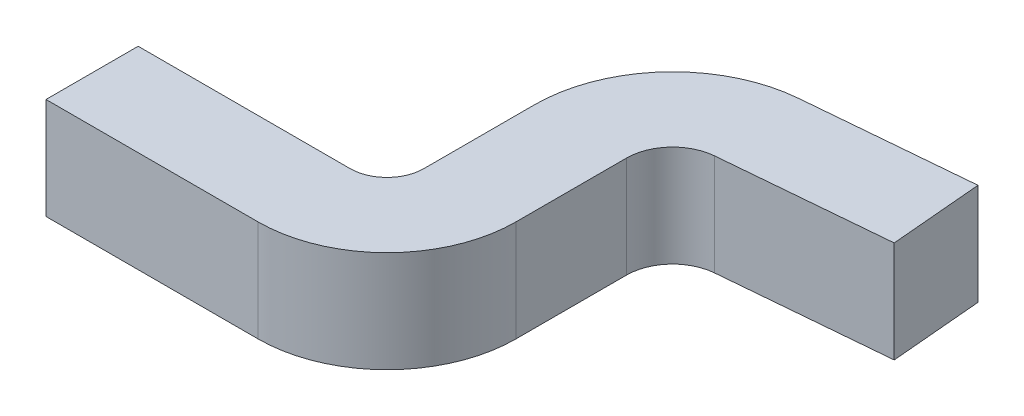
ISO-10303-21;
HEADER;
FILE_DESCRIPTION(('STEP AP214'),'2;1');
FILE_NAME('part.step','',(''),(''),'','','');
FILE_SCHEMA(('AUTOMOTIVE_DESIGN { 1 0 10303 214 1 1 1 1 }'));
ENDSEC;
DATA;
#1=APPLICATION_CONTEXT('core data for automotive mechanical design processes');
#2=APPLICATION_PROTOCOL_DEFINITION('international standard','automotive_design',2000,#1);
#3=PRODUCT_CONTEXT('',#1,'mechanical');
#4=PRODUCT('Part','Part','',(#3));
#5=PRODUCT_RELATED_PRODUCT_CATEGORY('part','',(#4));
#6=PRODUCT_DEFINITION_FORMATION('','',#4);
#7=PRODUCT_DEFINITION_CONTEXT('part definition',#1,'design');
#8=PRODUCT_DEFINITION('design','',#6,#7);
#9=PRODUCT_DEFINITION_SHAPE('','',#8);
#10=(LENGTH_UNIT() NAMED_UNIT(*) SI_UNIT(.MILLI.,.METRE.));
#11=(NAMED_UNIT(*) PLANE_ANGLE_UNIT() SI_UNIT($,.RADIAN.));
#12=(NAMED_UNIT(*) SI_UNIT($,.STERADIAN.) SOLID_ANGLE_UNIT());
#13=UNCERTAINTY_MEASURE_WITH_UNIT(LENGTH_MEASURE(1.E-05),#10,'distance_accuracy_value','');
#14=(GEOMETRIC_REPRESENTATION_CONTEXT(3) GLOBAL_UNCERTAINTY_ASSIGNED_CONTEXT((#13)) GLOBAL_UNIT_ASSIGNED_CONTEXT((#10,
#11,#12)) REPRESENTATION_CONTEXT('',''));
#15=CARTESIAN_POINT('',(0.,0.,0.));
#16=DIRECTION('',(0.,0.,1.));
#17=DIRECTION('',(1.,0.,0.));
#18=AXIS2_PLACEMENT_3D('',#15,#16,#17);
#19=CARTESIAN_POINT('',(5.445,-0.14,0.42500000000001));
#20=DIRECTION('',(0.,1.,0.));
#21=DIRECTION('',(0.,0.,1.));
#22=AXIS2_PLACEMENT_3D('',#19,#20,#21);
#23=PLANE('',#22);
#24=DIRECTION('',(-0.0871557427476632,0.,-0.996194698091745));
#25=VECTOR('',#24,1.);
#26=CARTESIAN_POINT('',(6.04,-0.14,0.199238939618369));
#27=LINE('',#26,#25);
#28=CARTESIAN_POINT('',(6.02256885145047,-0.14,0.));
#29=VERTEX_POINT('',#28);
#30=CARTESIAN_POINT('',(6.04,-0.14,0.199238939618369));
#31=VERTEX_POINT('',#30);
#32=EDGE_CURVE('E160',#29,#31,#27,.F.);
#33=ORIENTED_EDGE('',*,*,#32,.F.);
#34=DIRECTION('',(-0.996194698091745,0.,0.0871557427476612));
#35=VECTOR('',#34,1.);
#36=CARTESIAN_POINT('',(6.02256885145047,-0.14,0.));
#37=LINE('',#36,#35);
#38=CARTESIAN_POINT('',(5.66385327717569,-0.14,0.0313835461792554));
#39=VERTEX_POINT('',#38);
#40=EDGE_CURVE('E122',#39,#29,#37,.F.);
#41=ORIENTED_EDGE('',*,*,#40,.F.);
#42=CARTESIAN_POINT('',(5.68999999999999,-0.14,0.330241955606771));
#43=DIRECTION('',(0.,1.,0.));
#44=DIRECTION('',(0.,0.,1.));
#45=AXIS2_PLACEMENT_3D('',#42,#43,#44);
#46=CIRCLE('',#45,0.299999999999992);
#47=CARTESIAN_POINT('',(5.39,-0.14,0.33024195560677));
#48=VERTEX_POINT('',#47);
#49=EDGE_CURVE('E127',#48,#39,#46,.F.);
#50=ORIENTED_EDGE('',*,*,#49,.F.);
#51=DIRECTION('',(0.,0.,1.));
#52=VECTOR('',#51,1.);
#53=CARTESIAN_POINT('',(5.39,-0.14,0.330241955606771));
#54=LINE('',#53,#52);
#55=CARTESIAN_POINT('',(5.39,-0.14,0.57));
#56=VERTEX_POINT('',#55);
#57=EDGE_CURVE('E196',#56,#48,#54,.F.);
#58=ORIENTED_EDGE('',*,*,#57,.F.);
#59=CARTESIAN_POINT('',(5.31,-0.14,0.57));
#60=DIRECTION('',(0.,1.,0.));
#61=DIRECTION('',(0.,0.,1.));
#62=AXIS2_PLACEMENT_3D('',#59,#60,#61);
#63=CIRCLE('',#62,0.0800000000000001);
#64=CARTESIAN_POINT('',(5.31,-0.14,0.65));
#65=VERTEX_POINT('',#64);
#66=EDGE_CURVE('E238',#56,#65,#63,.F.);
#67=ORIENTED_EDGE('',*,*,#66,.T.);
#68=DIRECTION('',(-1.,0.,0.));
#69=VECTOR('',#68,1.);
#70=CARTESIAN_POINT('',(5.31,-0.14,0.65));
#71=LINE('',#70,#69);
#72=CARTESIAN_POINT('',(4.85,-0.14,0.65));
#73=VERTEX_POINT('',#72);
#74=EDGE_CURVE('E201',#73,#65,#71,.F.);
#75=ORIENTED_EDGE('',*,*,#74,.F.);
#76=DIRECTION('',(0.,0.,1.));
#77=VECTOR('',#76,1.);
#78=CARTESIAN_POINT('',(4.85,-0.14,0.65));
#79=LINE('',#78,#77);
#80=CARTESIAN_POINT('',(4.85,-0.14,0.85));
#81=VERTEX_POINT('',#80);
#82=EDGE_CURVE('E193',#81,#73,#79,.F.);
#83=ORIENTED_EDGE('',*,*,#82,.F.);
#84=DIRECTION('',(1.,0.,0.));
#85=VECTOR('',#84,1.);
#86=CARTESIAN_POINT('',(4.85,-0.14,0.85));
#87=LINE('',#86,#85);
#88=CARTESIAN_POINT('',(5.31,-0.14,0.85));
#89=VERTEX_POINT('',#88);
#90=EDGE_CURVE('E99',#89,#81,#87,.F.);
#91=ORIENTED_EDGE('',*,*,#90,.F.);
#92=CARTESIAN_POINT('',(5.31,-0.14,0.57));
#93=DIRECTION('',(0.,1.,0.));
#94=DIRECTION('',(0.,0.,1.));
#95=AXIS2_PLACEMENT_3D('',#92,#93,#94);
#96=CIRCLE('',#95,0.28);
#97=CARTESIAN_POINT('',(5.59,-0.14,0.570000000000001));
#98=VERTEX_POINT('',#97);
#99=EDGE_CURVE('E20',#98,#89,#96,.F.);
#100=ORIENTED_EDGE('',*,*,#99,.F.);
#101=DIRECTION('',(0.,0.,-1.));
#102=VECTOR('',#101,1.);
#103=CARTESIAN_POINT('',(5.59,-0.14,0.57));
#104=LINE('',#103,#102);
#105=CARTESIAN_POINT('',(5.59,-0.14,0.330241955606771));
#106=VERTEX_POINT('',#105);
#107=EDGE_CURVE('E88',#106,#98,#104,.F.);
#108=ORIENTED_EDGE('',*,*,#107,.F.);
#109=CARTESIAN_POINT('',(5.68999999999999,-0.14,0.330241955606771));
#110=DIRECTION('',(0.,1.,0.));
#111=DIRECTION('',(0.,0.,1.));
#112=AXIS2_PLACEMENT_3D('',#109,#110,#111);
#113=CIRCLE('',#112,0.0999999999999921);
#114=CARTESIAN_POINT('',(5.68128442572522,-0.14,0.230622485797604));
#115=VERTEX_POINT('',#114);
#116=EDGE_CURVE('E170',#106,#115,#113,.F.);
#117=ORIENTED_EDGE('',*,*,#116,.T.);
#118=DIRECTION('',(0.996194698091745,0.,-0.0871557427476609));
#119=VECTOR('',#118,1.);
#120=CARTESIAN_POINT('',(5.68128442572522,-0.14,0.230622485797604));
#121=LINE('',#120,#119);
#122=EDGE_CURVE('E166',#31,#115,#121,.F.);
#123=ORIENTED_EDGE('',*,*,#122,.F.);
#124=EDGE_LOOP('',(#33,#41,#50,#58,#67,#75,#83,#91,#100,#108,#117,#123));
#125=FACE_BOUND('',#124,.T.);
#126=ADVANCED_FACE('F17',(#125),#23,.T.);
#127=CARTESIAN_POINT('',(5.31,-0.25,0.65));
#128=DIRECTION('',(0.,0.,-1.));
#129=DIRECTION('',(-1.,0.,0.));
#130=AXIS2_PLACEMENT_3D('',#127,#128,#129);
#131=PLANE('',#130);
#132=DIRECTION('',(0.,1.,0.));
#133=VECTOR('',#132,1.);
#134=CARTESIAN_POINT('',(5.31,-0.25,0.65));
#135=LINE('',#134,#133);
#136=CARTESIAN_POINT('',(5.31,-0.36,0.65));
#137=VERTEX_POINT('',#136);
#138=EDGE_CURVE('E242',#65,#137,#135,.F.);
#139=ORIENTED_EDGE('',*,*,#138,.T.);
#140=DIRECTION('',(1.,0.,0.));
#141=VECTOR('',#140,1.);
#142=CARTESIAN_POINT('',(5.445,-0.36,0.65));
#143=LINE('',#142,#141);
#144=CARTESIAN_POINT('',(4.85,-0.36,0.65));
#145=VERTEX_POINT('',#144);
#146=EDGE_CURVE('E187',#137,#145,#143,.F.);
#147=ORIENTED_EDGE('',*,*,#146,.T.);
#148=DIRECTION('',(0.,1.,0.));
#149=VECTOR('',#148,1.);
#150=CARTESIAN_POINT('',(4.85,-0.25,0.65));
#151=LINE('',#150,#149);
#152=EDGE_CURVE('E190',#73,#145,#151,.F.);
#153=ORIENTED_EDGE('',*,*,#152,.F.);
#154=ORIENTED_EDGE('',*,*,#74,.T.);
#155=EDGE_LOOP('',(#139,#147,#153,#154));
#156=FACE_BOUND('',#155,.T.);
#157=ADVANCED_FACE('F299',(#156),#131,.T.);
#158=CARTESIAN_POINT('',(4.85,-0.25,0.65));
#159=DIRECTION('',(-1.,0.,0.));
#160=DIRECTION('',(0.,0.,1.));
#161=AXIS2_PLACEMENT_3D('',#158,#159,#160);
#162=PLANE('',#161);
#163=ORIENTED_EDGE('',*,*,#152,.T.);
#164=DIRECTION('',(0.,0.,1.));
#165=VECTOR('',#164,1.);
#166=CARTESIAN_POINT('',(4.85,-0.36,0.42500000000001));
#167=LINE('',#166,#165);
#168=CARTESIAN_POINT('',(4.85,-0.36,0.85));
#169=VERTEX_POINT('',#168);
#170=EDGE_CURVE('E182',#145,#169,#167,.T.);
#171=ORIENTED_EDGE('',*,*,#170,.T.);
#172=DIRECTION('',(0.,1.,0.));
#173=VECTOR('',#172,1.);
#174=CARTESIAN_POINT('',(4.85,-0.25,0.85));
#175=LINE('',#174,#173);
#176=EDGE_CURVE('E177',#81,#169,#175,.F.);
#177=ORIENTED_EDGE('',*,*,#176,.F.);
#178=ORIENTED_EDGE('',*,*,#82,.T.);
#179=EDGE_LOOP('',(#163,#171,#177,#178));
#180=FACE_BOUND('',#179,.T.);
#181=ADVANCED_FACE('F303',(#180),#162,.T.);
#182=CARTESIAN_POINT('',(4.85,-0.25,0.85));
#183=DIRECTION('',(0.,0.,1.));
#184=DIRECTION('',(1.,0.,0.));
#185=AXIS2_PLACEMENT_3D('',#182,#183,#184);
#186=PLANE('',#185);
#187=ORIENTED_EDGE('',*,*,#176,.T.);
#188=DIRECTION('',(1.,0.,0.));
#189=VECTOR('',#188,1.);
#190=CARTESIAN_POINT('',(5.445,-0.36,0.85));
#191=LINE('',#190,#189);
#192=CARTESIAN_POINT('',(5.31,-0.36,0.85));
#193=VERTEX_POINT('',#192);
#194=EDGE_CURVE('E186',#169,#193,#191,.T.);
#195=ORIENTED_EDGE('',*,*,#194,.T.);
#196=DIRECTION('',(0.,1.,0.));
#197=VECTOR('',#196,1.);
#198=CARTESIAN_POINT('',(5.31,-0.25,0.85));
#199=LINE('',#198,#197);
#200=EDGE_CURVE('E174',#89,#193,#199,.F.);
#201=ORIENTED_EDGE('',*,*,#200,.F.);
#202=ORIENTED_EDGE('',*,*,#90,.T.);
#203=EDGE_LOOP('',(#187,#195,#201,#202));
#204=FACE_BOUND('',#203,.T.);
#205=ADVANCED_FACE('F305',(#204),#186,.T.);
#206=CARTESIAN_POINT('',(5.31,-0.25,0.57));
#207=DIRECTION('',(0.,1.,0.));
#208=DIRECTION('',(0.,0.,1.));
#209=AXIS2_PLACEMENT_3D('',#206,#207,#208);
#210=CYLINDRICAL_SURFACE('',#209,0.28);
#211=ORIENTED_EDGE('',*,*,#200,.T.);
#212=CARTESIAN_POINT('',(5.31,-0.36,0.57));
#213=DIRECTION('',(0.,1.,0.));
#214=DIRECTION('',(0.,0.,1.));
#215=AXIS2_PLACEMENT_3D('',#212,#213,#214);
#216=CIRCLE('',#215,0.28);
#217=CARTESIAN_POINT('',(5.59,-0.36,0.57));
#218=VERTEX_POINT('',#217);
#219=EDGE_CURVE('E234',#193,#218,#216,.T.);
#220=ORIENTED_EDGE('',*,*,#219,.T.);
#221=DIRECTION('',(0.,1.,0.));
#222=VECTOR('',#221,1.);
#223=CARTESIAN_POINT('',(5.59,-0.25,0.57));
#224=LINE('',#223,#222);
#225=EDGE_CURVE('E171',#98,#218,#224,.F.);
#226=ORIENTED_EDGE('',*,*,#225,.F.);
#227=ORIENTED_EDGE('',*,*,#99,.T.);
#228=EDGE_LOOP('',(#211,#220,#226,#227));
#229=FACE_BOUND('',#228,.T.);
#230=ADVANCED_FACE('F306',(#229),#210,.T.);
#231=CARTESIAN_POINT('',(5.59,-0.25,0.57));
#232=DIRECTION('',(1.,0.,0.));
#233=DIRECTION('',(0.,0.,-1.));
#234=AXIS2_PLACEMENT_3D('',#231,#232,#233);
#235=PLANE('',#234);
#236=ORIENTED_EDGE('',*,*,#225,.T.);
#237=DIRECTION('',(0.,0.,1.));
#238=VECTOR('',#237,1.);
#239=CARTESIAN_POINT('',(5.59,-0.36,0.42500000000001));
#240=LINE('',#239,#238);
#241=CARTESIAN_POINT('',(5.59,-0.36,0.330241955606771));
#242=VERTEX_POINT('',#241);
#243=EDGE_CURVE('E233',#218,#242,#240,.F.);
#244=ORIENTED_EDGE('',*,*,#243,.T.);
#245=DIRECTION('',(0.,1.,0.));
#246=VECTOR('',#245,1.);
#247=CARTESIAN_POINT('',(5.59,-0.25,0.330241955606771));
#248=LINE('',#247,#246);
#249=EDGE_CURVE('E167',#242,#106,#248,.T.);
#250=ORIENTED_EDGE('',*,*,#249,.T.);
#251=ORIENTED_EDGE('',*,*,#107,.T.);
#252=EDGE_LOOP('',(#236,#244,#250,#251));
#253=FACE_BOUND('',#252,.T.);
#254=ADVANCED_FACE('F257',(#253),#235,.T.);
#255=CARTESIAN_POINT('',(5.68999999999999,-0.25,0.330241955606771));
#256=DIRECTION('',(0.,1.,0.));
#257=DIRECTION('',(0.,0.,1.));
#258=AXIS2_PLACEMENT_3D('',#255,#256,#257);
#259=CYLINDRICAL_SURFACE('',#258,0.0999999999999921);
#260=CARTESIAN_POINT('',(5.68999999999999,-0.36,0.330241955606771));
#261=DIRECTION('',(0.,1.,0.));
#262=DIRECTION('',(0.,0.,1.));
#263=AXIS2_PLACEMENT_3D('',#260,#261,#262);
#264=CIRCLE('',#263,0.0999999999999921);
#265=CARTESIAN_POINT('',(5.68128442572522,-0.36,0.230622485797604));
#266=VERTEX_POINT('',#265);
#267=EDGE_CURVE('E151',#242,#266,#264,.F.);
#268=ORIENTED_EDGE('',*,*,#267,.T.);
#269=DIRECTION('',(0.,1.,0.));
#270=VECTOR('',#269,1.);
#271=CARTESIAN_POINT('',(5.68128442572522,-0.25,0.230622485797604));
#272=LINE('',#271,#270);
#273=EDGE_CURVE('E163',#115,#266,#272,.F.);
#274=ORIENTED_EDGE('',*,*,#273,.F.);
#275=ORIENTED_EDGE('',*,*,#116,.F.);
#276=ORIENTED_EDGE('',*,*,#249,.F.);
#277=EDGE_LOOP('',(#268,#274,#275,#276));
#278=FACE_BOUND('',#277,.T.);
#279=ADVANCED_FACE('F250',(#278),#259,.F.);
#280=CARTESIAN_POINT('',(5.68128442572522,-0.25,0.230622485797604));
#281=DIRECTION('',(0.0871557427476609,0.,0.996194698091745));
#282=DIRECTION('',(0.996194698091745,0.,-0.0871557427476609));
#283=AXIS2_PLACEMENT_3D('',#280,#281,#282);
#284=PLANE('',#283);
#285=ORIENTED_EDGE('',*,*,#273,.T.);
#286=DIRECTION('',(0.996194698091745,0.,-0.0871557427476598));
#287=VECTOR('',#286,1.);
#288=CARTESIAN_POINT('',(5.68128442572522,-0.36,0.230622485797604));
#289=LINE('',#288,#287);
#290=CARTESIAN_POINT('',(6.04,-0.36,0.199238939618369));
#291=VERTEX_POINT('',#290);
#292=EDGE_CURVE('E145',#266,#291,#289,.T.);
#293=ORIENTED_EDGE('',*,*,#292,.T.);
#294=DIRECTION('',(0.,1.,0.));
#295=VECTOR('',#294,1.);
#296=CARTESIAN_POINT('',(6.04,-0.25,0.199238939618369));
#297=LINE('',#296,#295);
#298=EDGE_CURVE('E143',#31,#291,#297,.F.);
#299=ORIENTED_EDGE('',*,*,#298,.F.);
#300=ORIENTED_EDGE('',*,*,#122,.T.);
#301=EDGE_LOOP('',(#285,#293,#299,#300));
#302=FACE_BOUND('',#301,.T.);
#303=ADVANCED_FACE('F253',(#302),#284,.T.);
#304=CARTESIAN_POINT('',(6.04,-0.25,0.199238939618369));
#305=DIRECTION('',(0.996194698091745,0.,-0.0871557427476632));
#306=DIRECTION('',(-0.0871557427476632,0.,-0.996194698091745));
#307=AXIS2_PLACEMENT_3D('',#304,#305,#306);
#308=PLANE('',#307);
#309=ORIENTED_EDGE('',*,*,#298,.T.);
#310=DIRECTION('',(-0.0871557427476519,0.,-0.996194698091746));
#311=VECTOR('',#310,1.);
#312=CARTESIAN_POINT('',(6.04,-0.36,0.199238939618369));
#313=LINE('',#312,#311);
#314=CARTESIAN_POINT('',(6.02256885145047,-0.36,0.));
#315=VERTEX_POINT('',#314);
#316=EDGE_CURVE('E135',#291,#315,#313,.T.);
#317=ORIENTED_EDGE('',*,*,#316,.T.);
#318=DIRECTION('',(0.,1.,0.));
#319=VECTOR('',#318,1.);
#320=CARTESIAN_POINT('',(6.02256885145047,-0.25,0.));
#321=LINE('',#320,#319);
#322=EDGE_CURVE('E116',#29,#315,#321,.F.);
#323=ORIENTED_EDGE('',*,*,#322,.F.);
#324=ORIENTED_EDGE('',*,*,#32,.T.);
#325=EDGE_LOOP('',(#309,#317,#323,#324));
#326=FACE_BOUND('',#325,.T.);
#327=ADVANCED_FACE('F141',(#326),#308,.T.);
#328=CARTESIAN_POINT('',(6.02256885145047,-0.25,0.));
#329=DIRECTION('',(-0.0871557427476612,0.,-0.996194698091745));
#330=DIRECTION('',(-0.996194698091745,0.,0.0871557427476612));
#331=AXIS2_PLACEMENT_3D('',#328,#329,#330);
#332=PLANE('',#331);
#333=ORIENTED_EDGE('',*,*,#322,.T.);
#334=DIRECTION('',(-0.996194698091745,0.,0.0871557427476611));
#335=VECTOR('',#334,1.);
#336=CARTESIAN_POINT('',(6.02256885145047,-0.36,0.));
#337=LINE('',#336,#335);
#338=CARTESIAN_POINT('',(5.66385327717569,-0.36,0.0313835461792553));
#339=VERTEX_POINT('',#338);
#340=EDGE_CURVE('E120',#315,#339,#337,.T.);
#341=ORIENTED_EDGE('',*,*,#340,.T.);
#342=DIRECTION('',(0.,1.,0.));
#343=VECTOR('',#342,1.);
#344=CARTESIAN_POINT('',(5.66385327717569,-0.25,0.0313835461792553));
#345=LINE('',#344,#343);
#346=EDGE_CURVE('E200',#39,#339,#345,.F.);
#347=ORIENTED_EDGE('',*,*,#346,.F.);
#348=ORIENTED_EDGE('',*,*,#40,.T.);
#349=EDGE_LOOP('',(#333,#341,#347,#348));
#350=FACE_BOUND('',#349,.T.);
#351=ADVANCED_FACE('F118',(#350),#332,.T.);
#352=CARTESIAN_POINT('',(5.68999999999999,-0.25,0.330241955606771));
#353=DIRECTION('',(0.,1.,0.));
#354=DIRECTION('',(0.,0.,1.));
#355=AXIS2_PLACEMENT_3D('',#352,#353,#354);
#356=CYLINDRICAL_SURFACE('',#355,0.299999999999992);
#357=ORIENTED_EDGE('',*,*,#346,.T.);
#358=CARTESIAN_POINT('',(5.68999999999999,-0.36,0.330241955606771));
#359=DIRECTION('',(0.,1.,0.));
#360=DIRECTION('',(0.,0.,1.));
#361=AXIS2_PLACEMENT_3D('',#358,#359,#360);
#362=CIRCLE('',#361,0.299999999999992);
#363=CARTESIAN_POINT('',(5.39,-0.36,0.330241955606771));
#364=VERTEX_POINT('',#363);
#365=EDGE_CURVE('E138',#339,#364,#362,.T.);
#366=ORIENTED_EDGE('',*,*,#365,.T.);
#367=DIRECTION('',(0.,1.,0.));
#368=VECTOR('',#367,1.);
#369=CARTESIAN_POINT('',(5.39,-0.25,0.330241955606771));
#370=LINE('',#369,#368);
#371=EDGE_CURVE('E199',#48,#364,#370,.F.);
#372=ORIENTED_EDGE('',*,*,#371,.F.);
#373=ORIENTED_EDGE('',*,*,#49,.T.);
#374=EDGE_LOOP('',(#357,#366,#372,#373));
#375=FACE_BOUND('',#374,.T.);
#376=ADVANCED_FACE('F281',(#375),#356,.T.);
#377=CARTESIAN_POINT('',(5.39,-0.25,0.330241955606771));
#378=DIRECTION('',(-1.,0.,0.));
#379=DIRECTION('',(0.,0.,1.));
#380=AXIS2_PLACEMENT_3D('',#377,#378,#379);
#381=PLANE('',#380);
#382=ORIENTED_EDGE('',*,*,#371,.T.);
#383=DIRECTION('',(0.,0.,1.));
#384=VECTOR('',#383,1.);
#385=CARTESIAN_POINT('',(5.39,-0.36,0.42500000000001));
#386=LINE('',#385,#384);
#387=CARTESIAN_POINT('',(5.39,-0.36,0.57));
#388=VERTEX_POINT('',#387);
#389=EDGE_CURVE('E27',#364,#388,#386,.T.);
#390=ORIENTED_EDGE('',*,*,#389,.T.);
#391=DIRECTION('',(0.,1.,0.));
#392=VECTOR('',#391,1.);
#393=CARTESIAN_POINT('',(5.39,-0.25,0.57));
#394=LINE('',#393,#392);
#395=EDGE_CURVE('E35',#388,#56,#394,.T.);
#396=ORIENTED_EDGE('',*,*,#395,.T.);
#397=ORIENTED_EDGE('',*,*,#57,.T.);
#398=EDGE_LOOP('',(#382,#390,#396,#397));
#399=FACE_BOUND('',#398,.T.);
#400=ADVANCED_FACE('F288',(#399),#381,.T.);
#401=CARTESIAN_POINT('',(5.31,-0.25,0.57));
#402=DIRECTION('',(0.,1.,0.));
#403=DIRECTION('',(0.,0.,1.));
#404=AXIS2_PLACEMENT_3D('',#401,#402,#403);
#405=CYLINDRICAL_SURFACE('',#404,0.0800000000000001);
#406=CARTESIAN_POINT('',(5.31,-0.36,0.57));
#407=DIRECTION('',(0.,1.,0.));
#408=DIRECTION('',(0.,0.,1.));
#409=AXIS2_PLACEMENT_3D('',#406,#407,#408);
#410=CIRCLE('',#409,0.0800000000000001);
#411=EDGE_CURVE('E11',#388,#137,#410,.F.);
#412=ORIENTED_EDGE('',*,*,#411,.T.);
#413=ORIENTED_EDGE('',*,*,#138,.F.);
#414=ORIENTED_EDGE('',*,*,#66,.F.);
#415=ORIENTED_EDGE('',*,*,#395,.F.);
#416=EDGE_LOOP('',(#412,#413,#414,#415));
#417=FACE_BOUND('',#416,.T.);
#418=ADVANCED_FACE('F297',(#417),#405,.F.);
#419=CARTESIAN_POINT('',(5.445,-0.36,0.42500000000001));
#420=DIRECTION('',(0.,1.,0.));
#421=DIRECTION('',(0.,0.,1.));
#422=AXIS2_PLACEMENT_3D('',#419,#420,#421);
#423=PLANE('',#422);
#424=ORIENTED_EDGE('',*,*,#389,.F.);
#425=ORIENTED_EDGE('',*,*,#365,.F.);
#426=ORIENTED_EDGE('',*,*,#340,.F.);
#427=ORIENTED_EDGE('',*,*,#316,.F.);
#428=ORIENTED_EDGE('',*,*,#292,.F.);
#429=ORIENTED_EDGE('',*,*,#267,.F.);
#430=ORIENTED_EDGE('',*,*,#243,.F.);
#431=ORIENTED_EDGE('',*,*,#219,.F.);
#432=ORIENTED_EDGE('',*,*,#194,.F.);
#433=ORIENTED_EDGE('',*,*,#170,.F.);
#434=ORIENTED_EDGE('',*,*,#146,.F.);
#435=ORIENTED_EDGE('',*,*,#411,.F.);
#436=EDGE_LOOP('',(#424,#425,#426,#427,#428,#429,#430,#431,#432,#433,#434,#435));
#437=FACE_BOUND('',#436,.T.);
#438=ADVANCED_FACE('F133',(#437),#423,.F.);
#439=CLOSED_SHELL('',(#126,#157,#181,#205,#230,#254,#279,#303,#327,#351,#376,#400,#418,#438));
#440=MANIFOLD_SOLID_BREP('B1',#439);
#441=ADVANCED_BREP_SHAPE_REPRESENTATION('',(#18,#440),#14);
#442=SHAPE_DEFINITION_REPRESENTATION(#9,#441);
ENDSEC;
END-ISO-10303-21;
